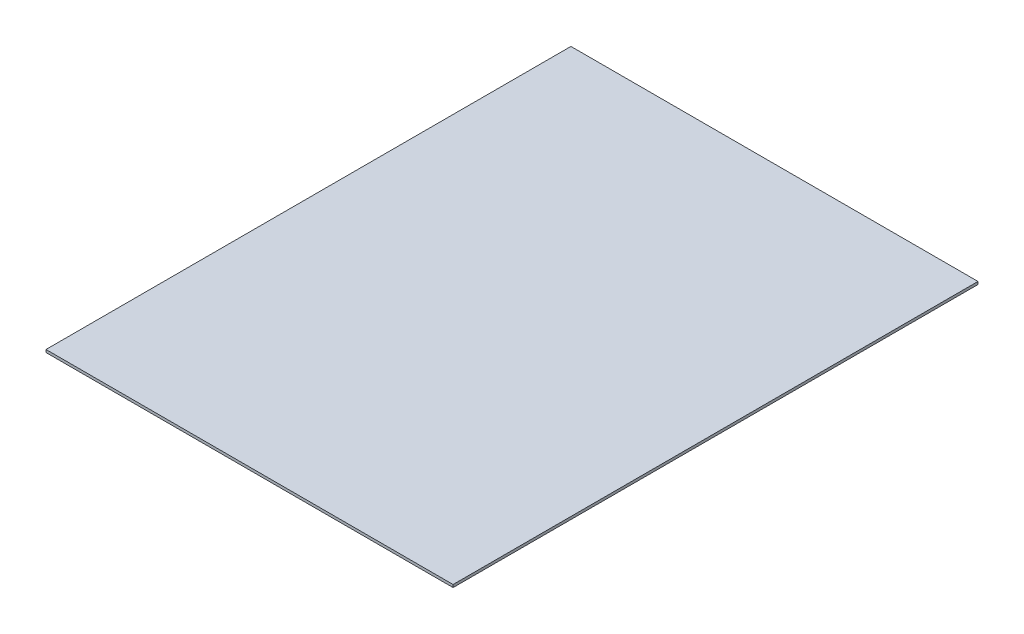
ISO-10303-21;
HEADER;
FILE_DESCRIPTION(('STEP AP214'),'2;1');
FILE_NAME('part.step','',(''),(''),'','','');
FILE_SCHEMA(('AUTOMOTIVE_DESIGN { 1 0 10303 214 1 1 1 1 }'));
ENDSEC;
DATA;
#1=APPLICATION_CONTEXT('core data for automotive mechanical design processes');
#2=APPLICATION_PROTOCOL_DEFINITION('international standard','automotive_design',2000,#1);
#3=PRODUCT_CONTEXT('',#1,'mechanical');
#4=PRODUCT('Part','Part','',(#3));
#5=PRODUCT_RELATED_PRODUCT_CATEGORY('part','',(#4));
#6=PRODUCT_DEFINITION_FORMATION('','',#4);
#7=PRODUCT_DEFINITION_CONTEXT('part definition',#1,'design');
#8=PRODUCT_DEFINITION('design','',#6,#7);
#9=PRODUCT_DEFINITION_SHAPE('','',#8);
#10=(LENGTH_UNIT() NAMED_UNIT(*) SI_UNIT(.MILLI.,.METRE.));
#11=(NAMED_UNIT(*) PLANE_ANGLE_UNIT() SI_UNIT($,.RADIAN.));
#12=(NAMED_UNIT(*) SI_UNIT($,.STERADIAN.) SOLID_ANGLE_UNIT());
#13=UNCERTAINTY_MEASURE_WITH_UNIT(LENGTH_MEASURE(1.E-05),#10,'distance_accuracy_value','');
#14=(GEOMETRIC_REPRESENTATION_CONTEXT(3) GLOBAL_UNCERTAINTY_ASSIGNED_CONTEXT((#13)) GLOBAL_UNIT_ASSIGNED_CONTEXT((#10,
#11,#12)) REPRESENTATION_CONTEXT('',''));
#15=CARTESIAN_POINT('',(0.,0.,0.));
#16=DIRECTION('',(0.,0.,1.));
#17=DIRECTION('',(1.,0.,0.));
#18=AXIS2_PLACEMENT_3D('',#15,#16,#17);
#19=CARTESIAN_POINT('',(241.3,3.175,311.15));
#20=DIRECTION('',(-1.,0.,0.));
#21=DIRECTION('',(0.,0.,1.));
#22=AXIS2_PLACEMENT_3D('',#19,#20,#21);
#23=PLANE('',#22);
#24=DIRECTION('',(0.,0.,-1.));
#25=VECTOR('',#24,1.);
#26=CARTESIAN_POINT('',(241.3,0.,311.15));
#27=LINE('',#26,#25);
#28=CARTESIAN_POINT('',(241.3,0.,311.15));
#29=VERTEX_POINT('',#28);
#30=CARTESIAN_POINT('',(241.3,0.,-311.15));
#31=VERTEX_POINT('',#30);
#32=EDGE_CURVE('E109',#29,#31,#27,.T.);
#33=ORIENTED_EDGE('',*,*,#32,.T.);
#34=DIRECTION('',(0.,-1.,0.));
#35=VECTOR('',#34,1.);
#36=CARTESIAN_POINT('',(241.3,3.175,-311.15));
#37=LINE('',#36,#35);
#38=CARTESIAN_POINT('',(241.3,3.175,-311.15));
#39=VERTEX_POINT('',#38);
#40=EDGE_CURVE('E11',#39,#31,#37,.T.);
#41=ORIENTED_EDGE('',*,*,#40,.F.);
#42=DIRECTION('',(0.,0.,-1.));
#43=VECTOR('',#42,1.);
#44=CARTESIAN_POINT('',(241.3,3.175,311.15));
#45=LINE('',#44,#43);
#46=CARTESIAN_POINT('',(241.3,3.175,311.15));
#47=VERTEX_POINT('',#46);
#48=EDGE_CURVE('E93',#47,#39,#45,.T.);
#49=ORIENTED_EDGE('',*,*,#48,.F.);
#50=DIRECTION('',(0.,-1.,0.));
#51=VECTOR('',#50,1.);
#52=CARTESIAN_POINT('',(241.3,3.175,311.15));
#53=LINE('',#52,#51);
#54=EDGE_CURVE('E105',#47,#29,#53,.T.);
#55=ORIENTED_EDGE('',*,*,#54,.T.);
#56=EDGE_LOOP('',(#33,#41,#49,#55));
#57=FACE_BOUND('',#56,.T.);
#58=ADVANCED_FACE('F41',(#57),#23,.F.);
#59=CARTESIAN_POINT('',(-241.3,3.175,-311.15));
#60=DIRECTION('',(0.,0.,1.));
#61=DIRECTION('',(1.,0.,0.));
#62=AXIS2_PLACEMENT_3D('',#59,#60,#61);
#63=PLANE('',#62);
#64=DIRECTION('',(-1.,0.,0.));
#65=VECTOR('',#64,1.);
#66=CARTESIAN_POINT('',(-241.3,0.,-311.15));
#67=LINE('',#66,#65);
#68=CARTESIAN_POINT('',(-241.3,0.,-311.15));
#69=VERTEX_POINT('',#68);
#70=EDGE_CURVE('E98',#31,#69,#67,.T.);
#71=ORIENTED_EDGE('',*,*,#70,.T.);
#72=DIRECTION('',(0.,-1.,0.));
#73=VECTOR('',#72,1.);
#74=CARTESIAN_POINT('',(-241.3,3.175,-311.15));
#75=LINE('',#74,#73);
#76=CARTESIAN_POINT('',(-241.3,3.175,-311.15));
#77=VERTEX_POINT('',#76);
#78=EDGE_CURVE('E50',#77,#69,#75,.T.);
#79=ORIENTED_EDGE('',*,*,#78,.F.);
#80=DIRECTION('',(-1.,0.,0.));
#81=VECTOR('',#80,1.);
#82=CARTESIAN_POINT('',(-241.3,3.175,-311.15));
#83=LINE('',#82,#81);
#84=EDGE_CURVE('E88',#39,#77,#83,.T.);
#85=ORIENTED_EDGE('',*,*,#84,.F.);
#86=ORIENTED_EDGE('',*,*,#40,.T.);
#87=EDGE_LOOP('',(#71,#79,#85,#86));
#88=FACE_BOUND('',#87,.T.);
#89=ADVANCED_FACE('F97',(#88),#63,.F.);
#90=CARTESIAN_POINT('',(-241.3,3.175,311.15));
#91=DIRECTION('',(1.,0.,0.));
#92=DIRECTION('',(0.,0.,-1.));
#93=AXIS2_PLACEMENT_3D('',#90,#91,#92);
#94=PLANE('',#93);
#95=DIRECTION('',(0.,0.,1.));
#96=VECTOR('',#95,1.);
#97=CARTESIAN_POINT('',(-241.3,0.,311.15));
#98=LINE('',#97,#96);
#99=CARTESIAN_POINT('',(-241.3,0.,311.15));
#100=VERTEX_POINT('',#99);
#101=EDGE_CURVE('E75',#69,#100,#98,.T.);
#102=ORIENTED_EDGE('',*,*,#101,.T.);
#103=DIRECTION('',(0.,-1.,0.));
#104=VECTOR('',#103,1.);
#105=CARTESIAN_POINT('',(-241.3,3.175,311.15));
#106=LINE('',#105,#104);
#107=CARTESIAN_POINT('',(-241.3,3.175,311.15));
#108=VERTEX_POINT('',#107);
#109=EDGE_CURVE('E100',#108,#100,#106,.T.);
#110=ORIENTED_EDGE('',*,*,#109,.F.);
#111=DIRECTION('',(0.,0.,1.));
#112=VECTOR('',#111,1.);
#113=CARTESIAN_POINT('',(-241.3,3.175,311.15));
#114=LINE('',#113,#112);
#115=EDGE_CURVE('E91',#77,#108,#114,.T.);
#116=ORIENTED_EDGE('',*,*,#115,.F.);
#117=ORIENTED_EDGE('',*,*,#78,.T.);
#118=EDGE_LOOP('',(#102,#110,#116,#117));
#119=FACE_BOUND('',#118,.T.);
#120=ADVANCED_FACE('F101',(#119),#94,.F.);
#121=CARTESIAN_POINT('',(-241.3,3.175,311.15));
#122=DIRECTION('',(0.,0.,-1.));
#123=DIRECTION('',(-1.,0.,0.));
#124=AXIS2_PLACEMENT_3D('',#121,#122,#123);
#125=PLANE('',#124);
#126=DIRECTION('',(1.,0.,0.));
#127=VECTOR('',#126,1.);
#128=CARTESIAN_POINT('',(-241.3,0.,311.15));
#129=LINE('',#128,#127);
#130=EDGE_CURVE('E81',#100,#29,#129,.T.);
#131=ORIENTED_EDGE('',*,*,#130,.T.);
#132=ORIENTED_EDGE('',*,*,#54,.F.);
#133=DIRECTION('',(1.,0.,0.));
#134=VECTOR('',#133,1.);
#135=CARTESIAN_POINT('',(-241.3,3.175,311.15));
#136=LINE('',#135,#134);
#137=EDGE_CURVE('E58',#108,#47,#136,.T.);
#138=ORIENTED_EDGE('',*,*,#137,.F.);
#139=ORIENTED_EDGE('',*,*,#109,.T.);
#140=EDGE_LOOP('',(#131,#132,#138,#139));
#141=FACE_BOUND('',#140,.T.);
#142=ADVANCED_FACE('F122',(#141),#125,.F.);
#143=CARTESIAN_POINT('',(0.,3.175,0.));
#144=DIRECTION('',(0.,-1.,0.));
#145=DIRECTION('',(0.,0.,-1.));
#146=AXIS2_PLACEMENT_3D('',#143,#144,#145);
#147=PLANE('',#146);
#148=ORIENTED_EDGE('',*,*,#48,.T.);
#149=ORIENTED_EDGE('',*,*,#84,.T.);
#150=ORIENTED_EDGE('',*,*,#115,.T.);
#151=ORIENTED_EDGE('',*,*,#137,.T.);
#152=EDGE_LOOP('',(#148,#149,#150,#151));
#153=FACE_BOUND('',#152,.T.);
#154=ADVANCED_FACE('F89',(#153),#147,.F.);
#155=CARTESIAN_POINT('',(0.,0.,0.));
#156=DIRECTION('',(0.,-1.,0.));
#157=DIRECTION('',(0.,0.,-1.));
#158=AXIS2_PLACEMENT_3D('',#155,#156,#157);
#159=PLANE('',#158);
#160=ORIENTED_EDGE('',*,*,#32,.F.);
#161=ORIENTED_EDGE('',*,*,#130,.F.);
#162=ORIENTED_EDGE('',*,*,#101,.F.);
#163=ORIENTED_EDGE('',*,*,#70,.F.);
#164=EDGE_LOOP('',(#160,#161,#162,#163));
#165=FACE_BOUND('',#164,.T.);
#166=ADVANCED_FACE('F125',(#165),#159,.T.);
#167=CLOSED_SHELL('',(#58,#89,#120,#142,#154,#166));
#168=MANIFOLD_SOLID_BREP('B2',#167);
#169=ADVANCED_BREP_SHAPE_REPRESENTATION('',(#18,#168),#14);
#170=SHAPE_DEFINITION_REPRESENTATION(#9,#169);
ENDSEC;
END-ISO-10303-21;
